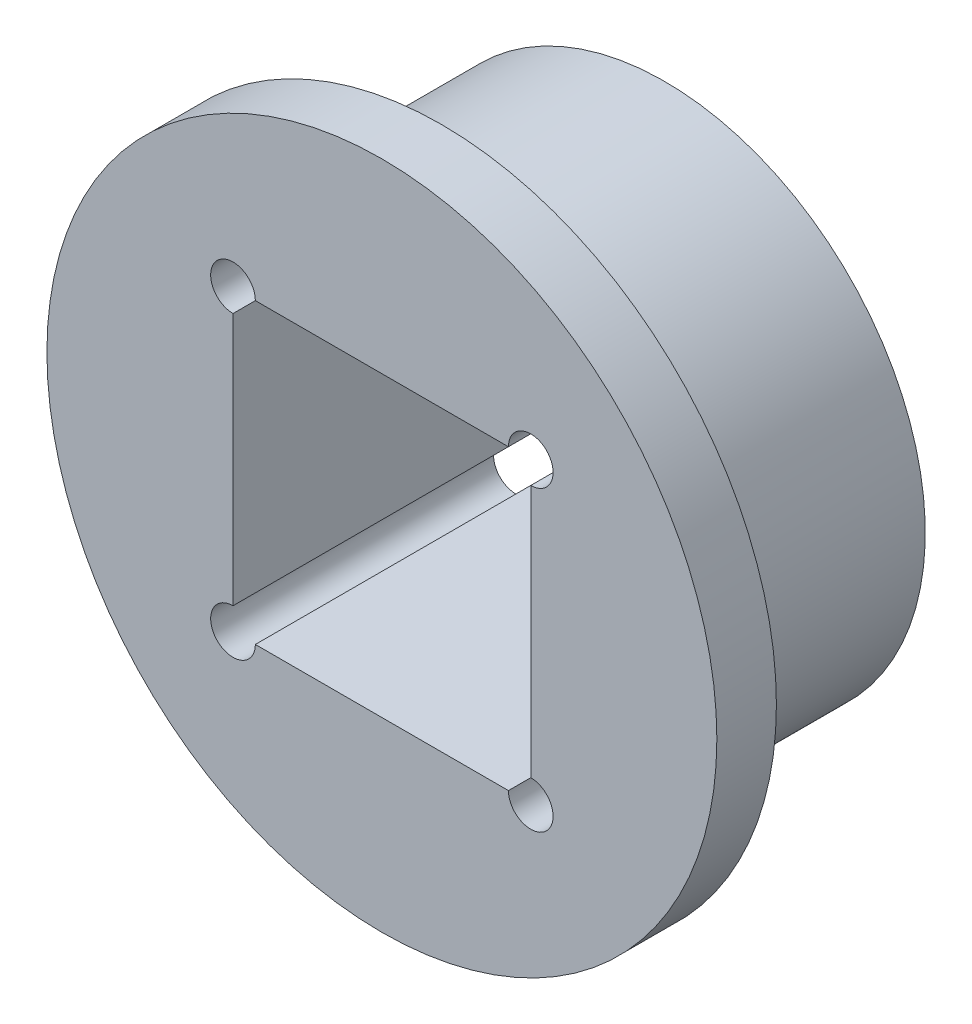
ISO-10303-21;
HEADER;
FILE_DESCRIPTION(('STEP AP214'),'2;1');
FILE_NAME('part.step','',(''),(''),'','','');
FILE_SCHEMA(('AUTOMOTIVE_DESIGN { 1 0 10303 214 1 1 1 1 }'));
ENDSEC;
DATA;
#1=APPLICATION_CONTEXT('core data for automotive mechanical design processes');
#2=APPLICATION_PROTOCOL_DEFINITION('international standard','automotive_design',2000,#1);
#3=PRODUCT_CONTEXT('',#1,'mechanical');
#4=PRODUCT('Part','Part','',(#3));
#5=PRODUCT_RELATED_PRODUCT_CATEGORY('part','',(#4));
#6=PRODUCT_DEFINITION_FORMATION('','',#4);
#7=PRODUCT_DEFINITION_CONTEXT('part definition',#1,'design');
#8=PRODUCT_DEFINITION('design','',#6,#7);
#9=PRODUCT_DEFINITION_SHAPE('','',#8);
#10=(LENGTH_UNIT() NAMED_UNIT(*) SI_UNIT(.MILLI.,.METRE.));
#11=(NAMED_UNIT(*) PLANE_ANGLE_UNIT() SI_UNIT($,.RADIAN.));
#12=(NAMED_UNIT(*) SI_UNIT($,.STERADIAN.) SOLID_ANGLE_UNIT());
#13=UNCERTAINTY_MEASURE_WITH_UNIT(LENGTH_MEASURE(1.E-05),#10,'distance_accuracy_value','');
#14=(GEOMETRIC_REPRESENTATION_CONTEXT(3) GLOBAL_UNCERTAINTY_ASSIGNED_CONTEXT((#13)) GLOBAL_UNIT_ASSIGNED_CONTEXT((#10,
#11,#12)) REPRESENTATION_CONTEXT('',''));
#15=CARTESIAN_POINT('',(0.,0.,0.));
#16=DIRECTION('',(0.,0.,1.));
#17=DIRECTION('',(1.,0.,0.));
#18=AXIS2_PLACEMENT_3D('',#15,#16,#17);
#19=CARTESIAN_POINT('',(0.,0.,4.));
#20=DIRECTION('',(0.,0.,-1.));
#21=DIRECTION('',(-1.,0.,0.));
#22=AXIS2_PLACEMENT_3D('',#19,#20,#21);
#23=CYLINDRICAL_SURFACE('',#22,22.5);
#24=CARTESIAN_POINT('',(0.,0.,4.));
#25=DIRECTION('',(0.,0.,1.));
#26=DIRECTION('',(1.,0.,0.));
#27=AXIS2_PLACEMENT_3D('',#24,#25,#26);
#28=CIRCLE('',#27,22.5);
#29=CARTESIAN_POINT('',(22.5,0.,4.));
#30=VERTEX_POINT('',#29);
#31=EDGE_CURVE('E52',#30,#30,#28,.T.);
#32=ORIENTED_EDGE('',*,*,#31,.F.);
#33=EDGE_LOOP('',(#32));
#34=FACE_BOUND('',#33,.T.);
#35=CARTESIAN_POINT('',(0.,0.,0.));
#36=DIRECTION('',(0.,0.,1.));
#37=DIRECTION('',(1.,0.,0.));
#38=AXIS2_PLACEMENT_3D('',#35,#36,#37);
#39=CIRCLE('',#38,22.5);
#40=CARTESIAN_POINT('',(22.5,0.,0.));
#41=VERTEX_POINT('',#40);
#42=EDGE_CURVE('E46',#41,#41,#39,.T.);
#43=ORIENTED_EDGE('',*,*,#42,.T.);
#44=EDGE_LOOP('',(#43));
#45=FACE_BOUND('',#44,.T.);
#46=ADVANCED_FACE('F43',(#34,#45),#23,.T.);
#47=CARTESIAN_POINT('',(0.,0.,4.));
#48=DIRECTION('',(0.,0.,1.));
#49=DIRECTION('',(1.,0.,0.));
#50=AXIS2_PLACEMENT_3D('',#47,#48,#49);
#51=PLANE('',#50);
#52=CARTESIAN_POINT('',(-10.,10.,4.));
#53=DIRECTION('',(0.,0.,1.));
#54=DIRECTION('',(1.,0.,0.));
#55=AXIS2_PLACEMENT_3D('',#52,#53,#54);
#56=CIRCLE('',#55,1.5);
#57=CARTESIAN_POINT('',(-8.5,10.,4.));
#58=VERTEX_POINT('',#57);
#59=CARTESIAN_POINT('',(-10.,8.5,4.));
#60=VERTEX_POINT('',#59);
#61=EDGE_CURVE('E60',#58,#60,#56,.T.);
#62=ORIENTED_EDGE('',*,*,#61,.F.);
#63=DIRECTION('',(1.,0.,0.));
#64=VECTOR('',#63,1.);
#65=CARTESIAN_POINT('',(0.,10.,4.));
#66=LINE('',#65,#64);
#67=CARTESIAN_POINT('',(8.49999999999999,10.,4.));
#68=VERTEX_POINT('',#67);
#69=EDGE_CURVE('E131',#58,#68,#66,.T.);
#70=ORIENTED_EDGE('',*,*,#69,.T.);
#71=CARTESIAN_POINT('',(9.99999999999999,10.,4.));
#72=DIRECTION('',(0.,0.,1.));
#73=DIRECTION('',(1.,0.,0.));
#74=AXIS2_PLACEMENT_3D('',#71,#72,#73);
#75=CIRCLE('',#74,1.5);
#76=CARTESIAN_POINT('',(9.99999999999999,8.5,4.));
#77=VERTEX_POINT('',#76);
#78=EDGE_CURVE('E135',#77,#68,#75,.T.);
#79=ORIENTED_EDGE('',*,*,#78,.F.);
#80=DIRECTION('',(0.,-1.,0.));
#81=VECTOR('',#80,1.);
#82=CARTESIAN_POINT('',(10.,0.,4.));
#83=LINE('',#82,#81);
#84=CARTESIAN_POINT('',(10.,-8.5,4.));
#85=VERTEX_POINT('',#84);
#86=EDGE_CURVE('E173',#77,#85,#83,.T.);
#87=ORIENTED_EDGE('',*,*,#86,.T.);
#88=CARTESIAN_POINT('',(10.,-10.,4.));
#89=DIRECTION('',(0.,0.,1.));
#90=DIRECTION('',(1.,0.,0.));
#91=AXIS2_PLACEMENT_3D('',#88,#89,#90);
#92=CIRCLE('',#91,1.5);
#93=CARTESIAN_POINT('',(8.5,-10.,4.));
#94=VERTEX_POINT('',#93);
#95=EDGE_CURVE('E169',#94,#85,#92,.T.);
#96=ORIENTED_EDGE('',*,*,#95,.F.);
#97=DIRECTION('',(1.,0.,0.));
#98=VECTOR('',#97,1.);
#99=CARTESIAN_POINT('',(0.,-10.,4.));
#100=LINE('',#99,#98);
#101=CARTESIAN_POINT('',(-8.5,-10.,4.));
#102=VERTEX_POINT('',#101);
#103=EDGE_CURVE('E165',#102,#94,#100,.T.);
#104=ORIENTED_EDGE('',*,*,#103,.F.);
#105=CARTESIAN_POINT('',(-10.,-9.99999999999999,4.));
#106=DIRECTION('',(0.,0.,1.));
#107=DIRECTION('',(1.,0.,0.));
#108=AXIS2_PLACEMENT_3D('',#105,#106,#107);
#109=CIRCLE('',#108,1.5);
#110=CARTESIAN_POINT('',(-10.,-8.49999999999999,4.));
#111=VERTEX_POINT('',#110);
#112=EDGE_CURVE('E161',#111,#102,#109,.T.);
#113=ORIENTED_EDGE('',*,*,#112,.F.);
#114=DIRECTION('',(0.,-1.,0.));
#115=VECTOR('',#114,1.);
#116=CARTESIAN_POINT('',(-10.,0.,4.));
#117=LINE('',#116,#115);
#118=EDGE_CURVE('E158',#60,#111,#117,.T.);
#119=ORIENTED_EDGE('',*,*,#118,.F.);
#120=EDGE_LOOP('',(#62,#70,#79,#87,#96,#104,#113,#119));
#121=FACE_BOUND('',#120,.T.);
#122=ORIENTED_EDGE('',*,*,#31,.T.);
#123=EDGE_LOOP('',(#122));
#124=FACE_BOUND('',#123,.T.);
#125=ADVANCED_FACE('F215',(#121,#124),#51,.T.);
#126=CARTESIAN_POINT('',(0.,0.,0.));
#127=DIRECTION('',(0.,0.,1.));
#128=DIRECTION('',(1.,0.,0.));
#129=AXIS2_PLACEMENT_3D('',#126,#127,#128);
#130=PLANE('',#129);
#131=CARTESIAN_POINT('',(0.,0.,0.));
#132=DIRECTION('',(0.,0.,-1.));
#133=DIRECTION('',(-1.,0.,0.));
#134=AXIS2_PLACEMENT_3D('',#131,#132,#133);
#135=CIRCLE('',#134,17.5);
#136=CARTESIAN_POINT('',(-17.5,0.,0.));
#137=VERTEX_POINT('',#136);
#138=EDGE_CURVE('E11',#137,#137,#135,.T.);
#139=ORIENTED_EDGE('',*,*,#138,.F.);
#140=EDGE_LOOP('',(#139));
#141=FACE_BOUND('',#140,.T.);
#142=ORIENTED_EDGE('',*,*,#42,.F.);
#143=EDGE_LOOP('',(#142));
#144=FACE_BOUND('',#143,.T.);
#145=ADVANCED_FACE('F212',(#141,#144),#130,.F.);
#146=CARTESIAN_POINT('',(0.,0.,-15.));
#147=DIRECTION('',(0.,0.,1.));
#148=DIRECTION('',(1.,0.,0.));
#149=AXIS2_PLACEMENT_3D('',#146,#147,#148);
#150=CYLINDRICAL_SURFACE('',#149,17.5);
#151=CARTESIAN_POINT('',(0.,0.,-15.));
#152=DIRECTION('',(0.,0.,-1.));
#153=DIRECTION('',(-1.,0.,0.));
#154=AXIS2_PLACEMENT_3D('',#151,#152,#153);
#155=CIRCLE('',#154,17.5);
#156=CARTESIAN_POINT('',(-17.5,0.,-15.));
#157=VERTEX_POINT('',#156);
#158=EDGE_CURVE('E183',#157,#157,#155,.T.);
#159=ORIENTED_EDGE('',*,*,#158,.F.);
#160=EDGE_LOOP('',(#159));
#161=FACE_BOUND('',#160,.T.);
#162=ORIENTED_EDGE('',*,*,#138,.T.);
#163=EDGE_LOOP('',(#162));
#164=FACE_BOUND('',#163,.T.);
#165=ADVANCED_FACE('F214',(#161,#164),#150,.T.);
#166=CARTESIAN_POINT('',(0.,0.,-15.));
#167=DIRECTION('',(0.,0.,-1.));
#168=DIRECTION('',(-1.,0.,0.));
#169=AXIS2_PLACEMENT_3D('',#166,#167,#168);
#170=PLANE('',#169);
#171=CARTESIAN_POINT('',(-10.,10.,-15.));
#172=DIRECTION('',(0.,0.,1.));
#173=DIRECTION('',(1.,0.,0.));
#174=AXIS2_PLACEMENT_3D('',#171,#172,#173);
#175=CIRCLE('',#174,1.5);
#176=CARTESIAN_POINT('',(-8.5,10.,-15.));
#177=VERTEX_POINT('',#176);
#178=CARTESIAN_POINT('',(-10.,8.5,-15.));
#179=VERTEX_POINT('',#178);
#180=EDGE_CURVE('E112',#177,#179,#175,.T.);
#181=ORIENTED_EDGE('',*,*,#180,.T.);
#182=DIRECTION('',(0.,-1.,0.));
#183=VECTOR('',#182,1.);
#184=CARTESIAN_POINT('',(-10.,0.,-15.));
#185=LINE('',#184,#183);
#186=CARTESIAN_POINT('',(-10.,-8.49999999999999,-15.));
#187=VERTEX_POINT('',#186);
#188=EDGE_CURVE('E122',#179,#187,#185,.T.);
#189=ORIENTED_EDGE('',*,*,#188,.T.);
#190=CARTESIAN_POINT('',(-10.,-9.99999999999999,-15.));
#191=DIRECTION('',(0.,0.,1.));
#192=DIRECTION('',(1.,0.,0.));
#193=AXIS2_PLACEMENT_3D('',#190,#191,#192);
#194=CIRCLE('',#193,1.5);
#195=CARTESIAN_POINT('',(-8.5,-10.,-15.));
#196=VERTEX_POINT('',#195);
#197=EDGE_CURVE('E68',#187,#196,#194,.T.);
#198=ORIENTED_EDGE('',*,*,#197,.T.);
#199=DIRECTION('',(1.,0.,0.));
#200=VECTOR('',#199,1.);
#201=CARTESIAN_POINT('',(0.,-10.,-15.));
#202=LINE('',#201,#200);
#203=CARTESIAN_POINT('',(8.5,-10.,-15.));
#204=VERTEX_POINT('',#203);
#205=EDGE_CURVE('E140',#196,#204,#202,.T.);
#206=ORIENTED_EDGE('',*,*,#205,.T.);
#207=CARTESIAN_POINT('',(10.,-10.,-15.));
#208=DIRECTION('',(0.,0.,1.));
#209=DIRECTION('',(1.,0.,0.));
#210=AXIS2_PLACEMENT_3D('',#207,#208,#209);
#211=CIRCLE('',#210,1.5);
#212=CARTESIAN_POINT('',(10.,-8.5,-15.));
#213=VERTEX_POINT('',#212);
#214=EDGE_CURVE('E144',#204,#213,#211,.T.);
#215=ORIENTED_EDGE('',*,*,#214,.T.);
#216=DIRECTION('',(0.,-1.,0.));
#217=VECTOR('',#216,1.);
#218=CARTESIAN_POINT('',(10.,0.,-15.));
#219=LINE('',#218,#217);
#220=CARTESIAN_POINT('',(9.99999999999999,8.5,-15.));
#221=VERTEX_POINT('',#220);
#222=EDGE_CURVE('E148',#221,#213,#219,.T.);
#223=ORIENTED_EDGE('',*,*,#222,.F.);
#224=CARTESIAN_POINT('',(9.99999999999999,10.,-15.));
#225=DIRECTION('',(0.,0.,1.));
#226=DIRECTION('',(1.,0.,0.));
#227=AXIS2_PLACEMENT_3D('',#224,#225,#226);
#228=CIRCLE('',#227,1.5);
#229=CARTESIAN_POINT('',(8.49999999999999,10.,-15.));
#230=VERTEX_POINT('',#229);
#231=EDGE_CURVE('E151',#221,#230,#228,.T.);
#232=ORIENTED_EDGE('',*,*,#231,.T.);
#233=DIRECTION('',(1.,0.,0.));
#234=VECTOR('',#233,1.);
#235=CARTESIAN_POINT('',(0.,10.,-15.));
#236=LINE('',#235,#234);
#237=EDGE_CURVE('E119',#177,#230,#236,.T.);
#238=ORIENTED_EDGE('',*,*,#237,.F.);
#239=EDGE_LOOP('',(#181,#189,#198,#206,#215,#223,#232,#238));
#240=FACE_BOUND('',#239,.T.);
#241=ORIENTED_EDGE('',*,*,#158,.T.);
#242=EDGE_LOOP('',(#241));
#243=FACE_BOUND('',#242,.T.);
#244=ADVANCED_FACE('F127',(#240,#243),#170,.T.);
#245=CARTESIAN_POINT('',(-10.,10.,-15.));
#246=DIRECTION('',(0.,0.,1.));
#247=DIRECTION('',(1.,0.,0.));
#248=AXIS2_PLACEMENT_3D('',#245,#246,#247);
#249=CYLINDRICAL_SURFACE('',#248,1.5);
#250=ORIENTED_EDGE('',*,*,#61,.T.);
#251=DIRECTION('',(0.,0.,1.));
#252=VECTOR('',#251,1.);
#253=CARTESIAN_POINT('',(-10.,8.5,-15.));
#254=LINE('',#253,#252);
#255=EDGE_CURVE('E108',#179,#60,#254,.T.);
#256=ORIENTED_EDGE('',*,*,#255,.F.);
#257=ORIENTED_EDGE('',*,*,#180,.F.);
#258=DIRECTION('',(0.,0.,1.));
#259=VECTOR('',#258,1.);
#260=CARTESIAN_POINT('',(-8.5,10.,-15.));
#261=LINE('',#260,#259);
#262=EDGE_CURVE('E180',#177,#58,#261,.T.);
#263=ORIENTED_EDGE('',*,*,#262,.T.);
#264=EDGE_LOOP('',(#250,#256,#257,#263));
#265=FACE_BOUND('',#264,.T.);
#266=ADVANCED_FACE('F110',(#265),#249,.F.);
#267=CARTESIAN_POINT('',(0.,10.,-15.));
#268=DIRECTION('',(0.,-1.,0.));
#269=DIRECTION('',(1.,0.,0.));
#270=AXIS2_PLACEMENT_3D('',#267,#268,#269);
#271=PLANE('',#270);
#272=ORIENTED_EDGE('',*,*,#69,.F.);
#273=ORIENTED_EDGE('',*,*,#262,.F.);
#274=ORIENTED_EDGE('',*,*,#237,.T.);
#275=DIRECTION('',(0.,0.,1.));
#276=VECTOR('',#275,1.);
#277=CARTESIAN_POINT('',(8.49999999999999,10.,-15.));
#278=LINE('',#277,#276);
#279=EDGE_CURVE('E184',#230,#68,#278,.T.);
#280=ORIENTED_EDGE('',*,*,#279,.T.);
#281=EDGE_LOOP('',(#272,#273,#274,#280));
#282=FACE_BOUND('',#281,.T.);
#283=ADVANCED_FACE('F257',(#282),#271,.T.);
#284=CARTESIAN_POINT('',(9.99999999999999,10.,-15.));
#285=DIRECTION('',(0.,0.,1.));
#286=DIRECTION('',(1.,0.,0.));
#287=AXIS2_PLACEMENT_3D('',#284,#285,#286);
#288=CYLINDRICAL_SURFACE('',#287,1.5);
#289=ORIENTED_EDGE('',*,*,#78,.T.);
#290=ORIENTED_EDGE('',*,*,#279,.F.);
#291=ORIENTED_EDGE('',*,*,#231,.F.);
#292=DIRECTION('',(0.,0.,1.));
#293=VECTOR('',#292,1.);
#294=CARTESIAN_POINT('',(9.99999999999999,8.5,-15.));
#295=LINE('',#294,#293);
#296=EDGE_CURVE('E187',#221,#77,#295,.T.);
#297=ORIENTED_EDGE('',*,*,#296,.T.);
#298=EDGE_LOOP('',(#289,#290,#291,#297));
#299=FACE_BOUND('',#298,.T.);
#300=ADVANCED_FACE('F267',(#299),#288,.F.);
#301=CARTESIAN_POINT('',(10.,0.,-15.));
#302=DIRECTION('',(-1.,0.,0.));
#303=DIRECTION('',(0.,-1.,0.));
#304=AXIS2_PLACEMENT_3D('',#301,#302,#303);
#305=PLANE('',#304);
#306=ORIENTED_EDGE('',*,*,#86,.F.);
#307=ORIENTED_EDGE('',*,*,#296,.F.);
#308=ORIENTED_EDGE('',*,*,#222,.T.);
#309=DIRECTION('',(0.,0.,1.));
#310=VECTOR('',#309,1.);
#311=CARTESIAN_POINT('',(10.,-8.5,-15.));
#312=LINE('',#311,#310);
#313=EDGE_CURVE('E190',#213,#85,#312,.T.);
#314=ORIENTED_EDGE('',*,*,#313,.T.);
#315=EDGE_LOOP('',(#306,#307,#308,#314));
#316=FACE_BOUND('',#315,.T.);
#317=ADVANCED_FACE('F278',(#316),#305,.T.);
#318=CARTESIAN_POINT('',(10.,-10.,-15.));
#319=DIRECTION('',(0.,0.,1.));
#320=DIRECTION('',(1.,0.,0.));
#321=AXIS2_PLACEMENT_3D('',#318,#319,#320);
#322=CYLINDRICAL_SURFACE('',#321,1.5);
#323=ORIENTED_EDGE('',*,*,#95,.T.);
#324=ORIENTED_EDGE('',*,*,#313,.F.);
#325=ORIENTED_EDGE('',*,*,#214,.F.);
#326=DIRECTION('',(0.,0.,1.));
#327=VECTOR('',#326,1.);
#328=CARTESIAN_POINT('',(8.5,-10.,-15.));
#329=LINE('',#328,#327);
#330=EDGE_CURVE('E193',#204,#94,#329,.T.);
#331=ORIENTED_EDGE('',*,*,#330,.T.);
#332=EDGE_LOOP('',(#323,#324,#325,#331));
#333=FACE_BOUND('',#332,.T.);
#334=ADVANCED_FACE('F289',(#333),#322,.F.);
#335=CARTESIAN_POINT('',(0.,-10.,-15.));
#336=DIRECTION('',(0.,-1.,0.));
#337=DIRECTION('',(1.,0.,0.));
#338=AXIS2_PLACEMENT_3D('',#335,#336,#337);
#339=PLANE('',#338);
#340=ORIENTED_EDGE('',*,*,#103,.T.);
#341=ORIENTED_EDGE('',*,*,#330,.F.);
#342=ORIENTED_EDGE('',*,*,#205,.F.);
#343=DIRECTION('',(0.,0.,1.));
#344=VECTOR('',#343,1.);
#345=CARTESIAN_POINT('',(-8.5,-10.,-15.));
#346=LINE('',#345,#344);
#347=EDGE_CURVE('E196',#196,#102,#346,.T.);
#348=ORIENTED_EDGE('',*,*,#347,.T.);
#349=EDGE_LOOP('',(#340,#341,#342,#348));
#350=FACE_BOUND('',#349,.T.);
#351=ADVANCED_FACE('F300',(#350),#339,.F.);
#352=CARTESIAN_POINT('',(-10.,-9.99999999999999,-15.));
#353=DIRECTION('',(0.,0.,1.));
#354=DIRECTION('',(1.,0.,0.));
#355=AXIS2_PLACEMENT_3D('',#352,#353,#354);
#356=CYLINDRICAL_SURFACE('',#355,1.5);
#357=ORIENTED_EDGE('',*,*,#112,.T.);
#358=ORIENTED_EDGE('',*,*,#347,.F.);
#359=ORIENTED_EDGE('',*,*,#197,.F.);
#360=DIRECTION('',(0.,0.,1.));
#361=VECTOR('',#360,1.);
#362=CARTESIAN_POINT('',(-10.,-8.49999999999999,-15.));
#363=LINE('',#362,#361);
#364=EDGE_CURVE('E118',#187,#111,#363,.T.);
#365=ORIENTED_EDGE('',*,*,#364,.T.);
#366=EDGE_LOOP('',(#357,#358,#359,#365));
#367=FACE_BOUND('',#366,.T.);
#368=ADVANCED_FACE('F311',(#367),#356,.F.);
#369=CARTESIAN_POINT('',(-10.,0.,-15.));
#370=DIRECTION('',(-1.,0.,0.));
#371=DIRECTION('',(0.,-1.,0.));
#372=AXIS2_PLACEMENT_3D('',#369,#370,#371);
#373=PLANE('',#372);
#374=ORIENTED_EDGE('',*,*,#118,.T.);
#375=ORIENTED_EDGE('',*,*,#364,.F.);
#376=ORIENTED_EDGE('',*,*,#188,.F.);
#377=ORIENTED_EDGE('',*,*,#255,.T.);
#378=EDGE_LOOP('',(#374,#375,#376,#377));
#379=FACE_BOUND('',#378,.T.);
#380=ADVANCED_FACE('F123',(#379),#373,.F.);
#381=CLOSED_SHELL('',(#46,#125,#145,#165,#244,#266,#283,#300,#317,#334,#351,#368,#380));
#382=MANIFOLD_SOLID_BREP('B2',#381);
#383=ADVANCED_BREP_SHAPE_REPRESENTATION('',(#18,#382),#14);
#384=SHAPE_DEFINITION_REPRESENTATION(#9,#383);
ENDSEC;
END-ISO-10303-21;
